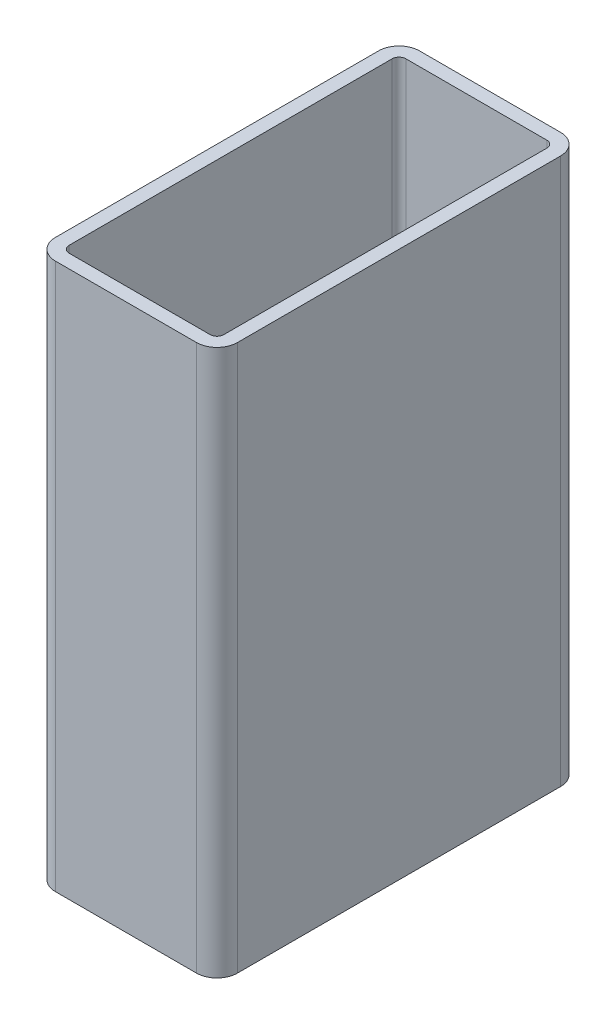
ISO-10303-21;
HEADER;
FILE_DESCRIPTION(('STEP AP214'),'2;1');
FILE_NAME('part.step','',(''),(''),'','','');
FILE_SCHEMA(('AUTOMOTIVE_DESIGN { 1 0 10303 214 1 1 1 1 }'));
ENDSEC;
DATA;
#1=APPLICATION_CONTEXT('core data for automotive mechanical design processes');
#2=APPLICATION_PROTOCOL_DEFINITION('international standard','automotive_design',2000,#1);
#3=PRODUCT_CONTEXT('',#1,'mechanical');
#4=PRODUCT('Part','Part','',(#3));
#5=PRODUCT_RELATED_PRODUCT_CATEGORY('part','',(#4));
#6=PRODUCT_DEFINITION_FORMATION('','',#4);
#7=PRODUCT_DEFINITION_CONTEXT('part definition',#1,'design');
#8=PRODUCT_DEFINITION('design','',#6,#7);
#9=PRODUCT_DEFINITION_SHAPE('','',#8);
#10=(LENGTH_UNIT() NAMED_UNIT(*) SI_UNIT(.MILLI.,.METRE.));
#11=(NAMED_UNIT(*) PLANE_ANGLE_UNIT() SI_UNIT($,.RADIAN.));
#12=(NAMED_UNIT(*) SI_UNIT($,.STERADIAN.) SOLID_ANGLE_UNIT());
#13=UNCERTAINTY_MEASURE_WITH_UNIT(LENGTH_MEASURE(1.E-05),#10,'distance_accuracy_value','');
#14=(GEOMETRIC_REPRESENTATION_CONTEXT(3) GLOBAL_UNCERTAINTY_ASSIGNED_CONTEXT((#13)) GLOBAL_UNIT_ASSIGNED_CONTEXT((#10,
#11,#12)) REPRESENTATION_CONTEXT('',''));
#15=CARTESIAN_POINT('',(0.,0.,0.));
#16=DIRECTION('',(0.,0.,1.));
#17=DIRECTION('',(1.,0.,0.));
#18=AXIS2_PLACEMENT_3D('',#15,#16,#17);
#19=CARTESIAN_POINT('',(-7.75,30.,-17.75));
#20=DIRECTION('',(0.,-1.,0.));
#21=DIRECTION('',(0.,0.,-1.));
#22=AXIS2_PLACEMENT_3D('',#19,#20,#21);
#23=CYLINDRICAL_SURFACE('',#22,2.25);
#24=CARTESIAN_POINT('',(-7.75,-30.,-17.75));
#25=DIRECTION('',(0.,-1.,0.));
#26=DIRECTION('',(0.,0.,-1.));
#27=AXIS2_PLACEMENT_3D('',#24,#25,#26);
#28=CIRCLE('',#27,2.25);
#29=CARTESIAN_POINT('',(-10.,-30.,-17.75));
#30=VERTEX_POINT('',#29);
#31=CARTESIAN_POINT('',(-7.74999999999999,-30.,-20.));
#32=VERTEX_POINT('',#31);
#33=EDGE_CURVE('E257',#30,#32,#28,.T.);
#34=ORIENTED_EDGE('',*,*,#33,.F.);
#35=DIRECTION('',(0.,-1.,0.));
#36=VECTOR('',#35,1.);
#37=CARTESIAN_POINT('',(-10.,30.,-17.75));
#38=LINE('',#37,#36);
#39=CARTESIAN_POINT('',(-10.,30.,-17.75));
#40=VERTEX_POINT('',#39);
#41=EDGE_CURVE('E12',#40,#30,#38,.T.);
#42=ORIENTED_EDGE('',*,*,#41,.F.);
#43=CARTESIAN_POINT('',(-7.75,30.,-17.75));
#44=DIRECTION('',(0.,-1.,0.));
#45=DIRECTION('',(0.,0.,-1.));
#46=AXIS2_PLACEMENT_3D('',#43,#44,#45);
#47=CIRCLE('',#46,2.25);
#48=CARTESIAN_POINT('',(-7.74999999999999,30.,-20.));
#49=VERTEX_POINT('',#48);
#50=EDGE_CURVE('E269',#40,#49,#47,.T.);
#51=ORIENTED_EDGE('',*,*,#50,.T.);
#52=DIRECTION('',(0.,-1.,0.));
#53=VECTOR('',#52,1.);
#54=CARTESIAN_POINT('',(-7.74999999999999,30.,-20.));
#55=LINE('',#54,#53);
#56=EDGE_CURVE('E92',#49,#32,#55,.T.);
#57=ORIENTED_EDGE('',*,*,#56,.T.);
#58=EDGE_LOOP('',(#34,#42,#51,#57));
#59=FACE_BOUND('',#58,.T.);
#60=ADVANCED_FACE('F89',(#59),#23,.T.);
#61=CARTESIAN_POINT('',(-10.,30.,17.75));
#62=DIRECTION('',(-1.,0.,0.));
#63=DIRECTION('',(0.,0.,1.));
#64=AXIS2_PLACEMENT_3D('',#61,#62,#63);
#65=PLANE('',#64);
#66=DIRECTION('',(0.,0.,-1.));
#67=VECTOR('',#66,1.);
#68=CARTESIAN_POINT('',(-10.,-30.,17.75));
#69=LINE('',#68,#67);
#70=CARTESIAN_POINT('',(-10.,-30.,17.75));
#71=VERTEX_POINT('',#70);
#72=EDGE_CURVE('E273',#71,#30,#69,.T.);
#73=ORIENTED_EDGE('',*,*,#72,.F.);
#74=DIRECTION('',(0.,-1.,0.));
#75=VECTOR('',#74,1.);
#76=CARTESIAN_POINT('',(-10.,30.,17.75));
#77=LINE('',#76,#75);
#78=CARTESIAN_POINT('',(-10.,30.,17.75));
#79=VERTEX_POINT('',#78);
#80=EDGE_CURVE('E97',#79,#71,#77,.T.);
#81=ORIENTED_EDGE('',*,*,#80,.F.);
#82=DIRECTION('',(0.,0.,-1.));
#83=VECTOR('',#82,1.);
#84=CARTESIAN_POINT('',(-10.,30.,17.75));
#85=LINE('',#84,#83);
#86=EDGE_CURVE('E288',#79,#40,#85,.T.);
#87=ORIENTED_EDGE('',*,*,#86,.T.);
#88=ORIENTED_EDGE('',*,*,#41,.T.);
#89=EDGE_LOOP('',(#73,#81,#87,#88));
#90=FACE_BOUND('',#89,.T.);
#91=ADVANCED_FACE('F336',(#90),#65,.T.);
#92=CARTESIAN_POINT('',(-7.75,30.,17.75));
#93=DIRECTION('',(0.,-1.,0.));
#94=DIRECTION('',(0.,0.,-1.));
#95=AXIS2_PLACEMENT_3D('',#92,#93,#94);
#96=CYLINDRICAL_SURFACE('',#95,2.25);
#97=CARTESIAN_POINT('',(-7.75,-30.,17.75));
#98=DIRECTION('',(0.,-1.,0.));
#99=DIRECTION('',(0.,0.,-1.));
#100=AXIS2_PLACEMENT_3D('',#97,#98,#99);
#101=CIRCLE('',#100,2.25);
#102=CARTESIAN_POINT('',(-7.74999999999999,-30.,20.));
#103=VERTEX_POINT('',#102);
#104=EDGE_CURVE('E306',#103,#71,#101,.T.);
#105=ORIENTED_EDGE('',*,*,#104,.F.);
#106=DIRECTION('',(0.,-1.,0.));
#107=VECTOR('',#106,1.);
#108=CARTESIAN_POINT('',(-7.74999999999999,30.,20.));
#109=LINE('',#108,#107);
#110=CARTESIAN_POINT('',(-7.74999999999999,30.,20.));
#111=VERTEX_POINT('',#110);
#112=EDGE_CURVE('E312',#111,#103,#109,.T.);
#113=ORIENTED_EDGE('',*,*,#112,.F.);
#114=CARTESIAN_POINT('',(-7.75,30.,17.75));
#115=DIRECTION('',(0.,-1.,0.));
#116=DIRECTION('',(0.,0.,-1.));
#117=AXIS2_PLACEMENT_3D('',#114,#115,#116);
#118=CIRCLE('',#117,2.25);
#119=EDGE_CURVE('E285',#111,#79,#118,.T.);
#120=ORIENTED_EDGE('',*,*,#119,.T.);
#121=ORIENTED_EDGE('',*,*,#80,.T.);
#122=EDGE_LOOP('',(#105,#113,#120,#121));
#123=FACE_BOUND('',#122,.T.);
#124=ADVANCED_FACE('F357',(#123),#96,.T.);
#125=CARTESIAN_POINT('',(-7.74999999999999,30.,20.));
#126=DIRECTION('',(0.,0.,-1.));
#127=DIRECTION('',(-1.,0.,0.));
#128=AXIS2_PLACEMENT_3D('',#125,#126,#127);
#129=PLANE('',#128);
#130=DIRECTION('',(1.,0.,0.));
#131=VECTOR('',#130,1.);
#132=CARTESIAN_POINT('',(-7.74999999999999,-30.,20.));
#133=LINE('',#132,#131);
#134=CARTESIAN_POINT('',(7.74999999999999,-30.,20.));
#135=VERTEX_POINT('',#134);
#136=EDGE_CURVE('E304',#103,#135,#133,.T.);
#137=ORIENTED_EDGE('',*,*,#136,.T.);
#138=DIRECTION('',(0.,-1.,0.));
#139=VECTOR('',#138,1.);
#140=CARTESIAN_POINT('',(7.74999999999999,30.,20.));
#141=LINE('',#140,#139);
#142=CARTESIAN_POINT('',(7.74999999999999,30.,20.));
#143=VERTEX_POINT('',#142);
#144=EDGE_CURVE('E314',#143,#135,#141,.T.);
#145=ORIENTED_EDGE('',*,*,#144,.F.);
#146=DIRECTION('',(1.,0.,0.));
#147=VECTOR('',#146,1.);
#148=CARTESIAN_POINT('',(-7.74999999999999,30.,20.));
#149=LINE('',#148,#147);
#150=EDGE_CURVE('E283',#111,#143,#149,.T.);
#151=ORIENTED_EDGE('',*,*,#150,.F.);
#152=ORIENTED_EDGE('',*,*,#112,.T.);
#153=EDGE_LOOP('',(#137,#145,#151,#152));
#154=FACE_BOUND('',#153,.T.);
#155=ADVANCED_FACE('F355',(#154),#129,.F.);
#156=CARTESIAN_POINT('',(7.75,30.,17.75));
#157=DIRECTION('',(0.,-1.,0.));
#158=DIRECTION('',(0.,0.,-1.));
#159=AXIS2_PLACEMENT_3D('',#156,#157,#158);
#160=CYLINDRICAL_SURFACE('',#159,2.25);
#161=CARTESIAN_POINT('',(7.75,-30.,17.75));
#162=DIRECTION('',(0.,1.,0.));
#163=DIRECTION('',(0.,0.,1.));
#164=AXIS2_PLACEMENT_3D('',#161,#162,#163);
#165=CIRCLE('',#164,2.25);
#166=CARTESIAN_POINT('',(10.,-30.,17.75));
#167=VERTEX_POINT('',#166);
#168=EDGE_CURVE('E302',#135,#167,#165,.T.);
#169=ORIENTED_EDGE('',*,*,#168,.T.);
#170=DIRECTION('',(0.,-1.,0.));
#171=VECTOR('',#170,1.);
#172=CARTESIAN_POINT('',(10.,30.,17.75));
#173=LINE('',#172,#171);
#174=CARTESIAN_POINT('',(10.,30.,17.75));
#175=VERTEX_POINT('',#174);
#176=EDGE_CURVE('E317',#175,#167,#173,.T.);
#177=ORIENTED_EDGE('',*,*,#176,.F.);
#178=CARTESIAN_POINT('',(7.75,30.,17.75));
#179=DIRECTION('',(0.,1.,0.));
#180=DIRECTION('',(0.,0.,1.));
#181=AXIS2_PLACEMENT_3D('',#178,#179,#180);
#182=CIRCLE('',#181,2.25);
#183=EDGE_CURVE('E281',#143,#175,#182,.T.);
#184=ORIENTED_EDGE('',*,*,#183,.F.);
#185=ORIENTED_EDGE('',*,*,#144,.T.);
#186=EDGE_LOOP('',(#169,#177,#184,#185));
#187=FACE_BOUND('',#186,.T.);
#188=ADVANCED_FACE('F351',(#187),#160,.T.);
#189=CARTESIAN_POINT('',(10.,30.,17.75));
#190=DIRECTION('',(-1.,0.,0.));
#191=DIRECTION('',(0.,0.,1.));
#192=AXIS2_PLACEMENT_3D('',#189,#190,#191);
#193=PLANE('',#192);
#194=DIRECTION('',(0.,0.,-1.));
#195=VECTOR('',#194,1.);
#196=CARTESIAN_POINT('',(10.,-30.,17.75));
#197=LINE('',#196,#195);
#198=CARTESIAN_POINT('',(10.,-30.,-17.75));
#199=VERTEX_POINT('',#198);
#200=EDGE_CURVE('E299',#167,#199,#197,.T.);
#201=ORIENTED_EDGE('',*,*,#200,.T.);
#202=DIRECTION('',(0.,-1.,0.));
#203=VECTOR('',#202,1.);
#204=CARTESIAN_POINT('',(10.,30.,-17.75));
#205=LINE('',#204,#203);
#206=CARTESIAN_POINT('',(10.,30.,-17.75));
#207=VERTEX_POINT('',#206);
#208=EDGE_CURVE('E320',#207,#199,#205,.T.);
#209=ORIENTED_EDGE('',*,*,#208,.F.);
#210=DIRECTION('',(0.,0.,-1.));
#211=VECTOR('',#210,1.);
#212=CARTESIAN_POINT('',(10.,30.,17.75));
#213=LINE('',#212,#211);
#214=EDGE_CURVE('E279',#175,#207,#213,.T.);
#215=ORIENTED_EDGE('',*,*,#214,.F.);
#216=ORIENTED_EDGE('',*,*,#176,.T.);
#217=EDGE_LOOP('',(#201,#209,#215,#216));
#218=FACE_BOUND('',#217,.T.);
#219=ADVANCED_FACE('F347',(#218),#193,.F.);
#220=CARTESIAN_POINT('',(7.75,30.,-17.75));
#221=DIRECTION('',(0.,-1.,0.));
#222=DIRECTION('',(0.,0.,-1.));
#223=AXIS2_PLACEMENT_3D('',#220,#221,#222);
#224=CYLINDRICAL_SURFACE('',#223,2.25);
#225=CARTESIAN_POINT('',(7.75,-30.,-17.75));
#226=DIRECTION('',(0.,-1.,0.));
#227=DIRECTION('',(0.,0.,-1.));
#228=AXIS2_PLACEMENT_3D('',#225,#226,#227);
#229=CIRCLE('',#228,2.25);
#230=CARTESIAN_POINT('',(7.74999999999999,-30.,-20.));
#231=VERTEX_POINT('',#230);
#232=EDGE_CURVE('E296',#231,#199,#229,.T.);
#233=ORIENTED_EDGE('',*,*,#232,.F.);
#234=DIRECTION('',(0.,-1.,0.));
#235=VECTOR('',#234,1.);
#236=CARTESIAN_POINT('',(7.74999999999999,30.,-20.));
#237=LINE('',#236,#235);
#238=CARTESIAN_POINT('',(7.74999999999999,30.,-20.));
#239=VERTEX_POINT('',#238);
#240=EDGE_CURVE('E321',#239,#231,#237,.T.);
#241=ORIENTED_EDGE('',*,*,#240,.F.);
#242=CARTESIAN_POINT('',(7.75,30.,-17.75));
#243=DIRECTION('',(0.,-1.,0.));
#244=DIRECTION('',(0.,0.,-1.));
#245=AXIS2_PLACEMENT_3D('',#242,#243,#244);
#246=CIRCLE('',#245,2.25);
#247=EDGE_CURVE('E276',#239,#207,#246,.T.);
#248=ORIENTED_EDGE('',*,*,#247,.T.);
#249=ORIENTED_EDGE('',*,*,#208,.T.);
#250=EDGE_LOOP('',(#233,#241,#248,#249));
#251=FACE_BOUND('',#250,.T.);
#252=ADVANCED_FACE('F343',(#251),#224,.T.);
#253=CARTESIAN_POINT('',(-7.74999999999999,30.,-20.));
#254=DIRECTION('',(0.,0.,-1.));
#255=DIRECTION('',(-1.,0.,0.));
#256=AXIS2_PLACEMENT_3D('',#253,#254,#255);
#257=PLANE('',#256);
#258=DIRECTION('',(1.,0.,0.));
#259=VECTOR('',#258,1.);
#260=CARTESIAN_POINT('',(-7.74999999999999,-30.,-20.));
#261=LINE('',#260,#259);
#262=EDGE_CURVE('E293',#32,#231,#261,.T.);
#263=ORIENTED_EDGE('',*,*,#262,.F.);
#264=ORIENTED_EDGE('',*,*,#56,.F.);
#265=DIRECTION('',(1.,0.,0.));
#266=VECTOR('',#265,1.);
#267=CARTESIAN_POINT('',(-7.74999999999999,30.,-20.));
#268=LINE('',#267,#266);
#269=EDGE_CURVE('E272',#49,#239,#268,.T.);
#270=ORIENTED_EDGE('',*,*,#269,.T.);
#271=ORIENTED_EDGE('',*,*,#240,.T.);
#272=EDGE_LOOP('',(#263,#264,#270,#271));
#273=FACE_BOUND('',#272,.T.);
#274=ADVANCED_FACE('F329',(#273),#257,.T.);
#275=CARTESIAN_POINT('',(-7.75,30.,-17.75));
#276=DIRECTION('',(0.,-1.,0.));
#277=DIRECTION('',(0.,0.,-1.));
#278=AXIS2_PLACEMENT_3D('',#275,#276,#277);
#279=PLANE('',#278);
#280=DIRECTION('',(0.,0.,-1.));
#281=VECTOR('',#280,1.);
#282=CARTESIAN_POINT('',(-8.5,30.,17.75));
#283=LINE('',#282,#281);
#284=CARTESIAN_POINT('',(-8.5,30.,17.75));
#285=VERTEX_POINT('',#284);
#286=CARTESIAN_POINT('',(-8.5,30.,-17.75));
#287=VERTEX_POINT('',#286);
#288=EDGE_CURVE('E211',#285,#287,#283,.T.);
#289=ORIENTED_EDGE('',*,*,#288,.T.);
#290=CARTESIAN_POINT('',(-7.75,30.,-17.75));
#291=DIRECTION('',(0.,-1.,0.));
#292=DIRECTION('',(0.,0.,-1.));
#293=AXIS2_PLACEMENT_3D('',#290,#291,#292);
#294=CIRCLE('',#293,0.749999999999998);
#295=CARTESIAN_POINT('',(-7.74999999999999,30.,-18.5));
#296=VERTEX_POINT('',#295);
#297=EDGE_CURVE('E205',#287,#296,#294,.T.);
#298=ORIENTED_EDGE('',*,*,#297,.T.);
#299=DIRECTION('',(1.,0.,0.));
#300=VECTOR('',#299,1.);
#301=CARTESIAN_POINT('',(-7.74999999999999,30.,-18.5));
#302=LINE('',#301,#300);
#303=CARTESIAN_POINT('',(7.74999999999999,30.,-18.5));
#304=VERTEX_POINT('',#303);
#305=EDGE_CURVE('E214',#296,#304,#302,.T.);
#306=ORIENTED_EDGE('',*,*,#305,.T.);
#307=CARTESIAN_POINT('',(7.75,30.,-17.75));
#308=DIRECTION('',(0.,-1.,0.));
#309=DIRECTION('',(0.,0.,-1.));
#310=AXIS2_PLACEMENT_3D('',#307,#308,#309);
#311=CIRCLE('',#310,0.749999999999998);
#312=CARTESIAN_POINT('',(8.5,30.,-17.75));
#313=VERTEX_POINT('',#312);
#314=EDGE_CURVE('E105',#304,#313,#311,.T.);
#315=ORIENTED_EDGE('',*,*,#314,.T.);
#316=DIRECTION('',(0.,0.,-1.));
#317=VECTOR('',#316,1.);
#318=CARTESIAN_POINT('',(8.5,30.,17.75));
#319=LINE('',#318,#317);
#320=CARTESIAN_POINT('',(8.5,30.,17.75));
#321=VERTEX_POINT('',#320);
#322=EDGE_CURVE('E229',#321,#313,#319,.T.);
#323=ORIENTED_EDGE('',*,*,#322,.F.);
#324=CARTESIAN_POINT('',(7.75,30.,17.75));
#325=DIRECTION('',(0.,1.,0.));
#326=DIRECTION('',(0.,0.,1.));
#327=AXIS2_PLACEMENT_3D('',#324,#325,#326);
#328=CIRCLE('',#327,0.75);
#329=CARTESIAN_POINT('',(7.75,30.,18.5));
#330=VERTEX_POINT('',#329);
#331=EDGE_CURVE('E231',#330,#321,#328,.T.);
#332=ORIENTED_EDGE('',*,*,#331,.F.);
#333=DIRECTION('',(1.,0.,0.));
#334=VECTOR('',#333,1.);
#335=CARTESIAN_POINT('',(-7.74999999999999,30.,18.5));
#336=LINE('',#335,#334);
#337=CARTESIAN_POINT('',(-7.74999999999999,30.,18.5));
#338=VERTEX_POINT('',#337);
#339=EDGE_CURVE('E233',#338,#330,#336,.T.);
#340=ORIENTED_EDGE('',*,*,#339,.F.);
#341=CARTESIAN_POINT('',(-7.75,30.,17.75));
#342=DIRECTION('',(0.,-1.,0.));
#343=DIRECTION('',(0.,0.,-1.));
#344=AXIS2_PLACEMENT_3D('',#341,#342,#343);
#345=CIRCLE('',#344,0.749999999999998);
#346=EDGE_CURVE('E235',#338,#285,#345,.T.);
#347=ORIENTED_EDGE('',*,*,#346,.T.);
#348=EDGE_LOOP('',(#289,#298,#306,#315,#323,#332,#340,#347));
#349=FACE_BOUND('',#348,.T.);
#350=ORIENTED_EDGE('',*,*,#50,.F.);
#351=ORIENTED_EDGE('',*,*,#86,.F.);
#352=ORIENTED_EDGE('',*,*,#119,.F.);
#353=ORIENTED_EDGE('',*,*,#150,.T.);
#354=ORIENTED_EDGE('',*,*,#183,.T.);
#355=ORIENTED_EDGE('',*,*,#214,.T.);
#356=ORIENTED_EDGE('',*,*,#247,.F.);
#357=ORIENTED_EDGE('',*,*,#269,.F.);
#358=EDGE_LOOP('',(#350,#351,#352,#353,#354,#355,#356,#357));
#359=FACE_BOUND('',#358,.T.);
#360=ADVANCED_FACE('F218',(#349,#359),#279,.F.);
#361=CARTESIAN_POINT('',(-7.75,-30.,-17.75));
#362=DIRECTION('',(0.,-1.,0.));
#363=DIRECTION('',(0.,0.,-1.));
#364=AXIS2_PLACEMENT_3D('',#361,#362,#363);
#365=PLANE('',#364);
#366=CARTESIAN_POINT('',(-7.75,-30.,-17.75));
#367=DIRECTION('',(0.,-1.,0.));
#368=DIRECTION('',(0.,0.,-1.));
#369=AXIS2_PLACEMENT_3D('',#366,#367,#368);
#370=CIRCLE('',#369,0.749999999999998);
#371=CARTESIAN_POINT('',(-8.5,-30.,-17.75));
#372=VERTEX_POINT('',#371);
#373=CARTESIAN_POINT('',(-7.74999999999999,-30.,-18.5));
#374=VERTEX_POINT('',#373);
#375=EDGE_CURVE('E113',#372,#374,#370,.T.);
#376=ORIENTED_EDGE('',*,*,#375,.F.);
#377=DIRECTION('',(0.,0.,-1.));
#378=VECTOR('',#377,1.);
#379=CARTESIAN_POINT('',(-8.5,-30.,17.75));
#380=LINE('',#379,#378);
#381=CARTESIAN_POINT('',(-8.5,-30.,17.75));
#382=VERTEX_POINT('',#381);
#383=EDGE_CURVE('E222',#382,#372,#380,.T.);
#384=ORIENTED_EDGE('',*,*,#383,.F.);
#385=CARTESIAN_POINT('',(-7.75,-30.,17.75));
#386=DIRECTION('',(0.,-1.,0.));
#387=DIRECTION('',(0.,0.,-1.));
#388=AXIS2_PLACEMENT_3D('',#385,#386,#387);
#389=CIRCLE('',#388,0.749999999999998);
#390=CARTESIAN_POINT('',(-7.74999999999999,-30.,18.5));
#391=VERTEX_POINT('',#390);
#392=EDGE_CURVE('E225',#391,#382,#389,.T.);
#393=ORIENTED_EDGE('',*,*,#392,.F.);
#394=DIRECTION('',(1.,0.,0.));
#395=VECTOR('',#394,1.);
#396=CARTESIAN_POINT('',(-7.74999999999999,-30.,18.5));
#397=LINE('',#396,#395);
#398=CARTESIAN_POINT('',(7.75,-30.,18.5));
#399=VERTEX_POINT('',#398);
#400=EDGE_CURVE('E250',#391,#399,#397,.T.);
#401=ORIENTED_EDGE('',*,*,#400,.T.);
#402=CARTESIAN_POINT('',(7.75,-30.,17.75));
#403=DIRECTION('',(0.,1.,0.));
#404=DIRECTION('',(0.,0.,1.));
#405=AXIS2_PLACEMENT_3D('',#402,#403,#404);
#406=CIRCLE('',#405,0.75);
#407=CARTESIAN_POINT('',(8.5,-30.,17.75));
#408=VERTEX_POINT('',#407);
#409=EDGE_CURVE('E247',#399,#408,#406,.T.);
#410=ORIENTED_EDGE('',*,*,#409,.T.);
#411=DIRECTION('',(0.,0.,-1.));
#412=VECTOR('',#411,1.);
#413=CARTESIAN_POINT('',(8.5,-30.,17.75));
#414=LINE('',#413,#412);
#415=CARTESIAN_POINT('',(8.5,-30.,-17.75));
#416=VERTEX_POINT('',#415);
#417=EDGE_CURVE('E244',#408,#416,#414,.T.);
#418=ORIENTED_EDGE('',*,*,#417,.T.);
#419=CARTESIAN_POINT('',(7.75,-30.,-17.75));
#420=DIRECTION('',(0.,-1.,0.));
#421=DIRECTION('',(0.,0.,-1.));
#422=AXIS2_PLACEMENT_3D('',#419,#420,#421);
#423=CIRCLE('',#422,0.749999999999998);
#424=CARTESIAN_POINT('',(7.74999999999999,-30.,-18.5));
#425=VERTEX_POINT('',#424);
#426=EDGE_CURVE('E241',#425,#416,#423,.T.);
#427=ORIENTED_EDGE('',*,*,#426,.F.);
#428=DIRECTION('',(1.,0.,0.));
#429=VECTOR('',#428,1.);
#430=CARTESIAN_POINT('',(-7.74999999999999,-30.,-18.5));
#431=LINE('',#430,#429);
#432=EDGE_CURVE('E239',#374,#425,#431,.T.);
#433=ORIENTED_EDGE('',*,*,#432,.F.);
#434=EDGE_LOOP('',(#376,#384,#393,#401,#410,#418,#427,#433));
#435=FACE_BOUND('',#434,.T.);
#436=ORIENTED_EDGE('',*,*,#33,.T.);
#437=ORIENTED_EDGE('',*,*,#262,.T.);
#438=ORIENTED_EDGE('',*,*,#232,.T.);
#439=ORIENTED_EDGE('',*,*,#200,.F.);
#440=ORIENTED_EDGE('',*,*,#168,.F.);
#441=ORIENTED_EDGE('',*,*,#136,.F.);
#442=ORIENTED_EDGE('',*,*,#104,.T.);
#443=ORIENTED_EDGE('',*,*,#72,.T.);
#444=EDGE_LOOP('',(#436,#437,#438,#439,#440,#441,#442,#443));
#445=FACE_BOUND('',#444,.T.);
#446=ADVANCED_FACE('F331',(#435,#445),#365,.T.);
#447=CARTESIAN_POINT('',(-7.75,30.,-17.75));
#448=DIRECTION('',(0.,-1.,0.));
#449=DIRECTION('',(0.,0.,-1.));
#450=AXIS2_PLACEMENT_3D('',#447,#448,#449);
#451=CYLINDRICAL_SURFACE('',#450,0.749999999999998);
#452=ORIENTED_EDGE('',*,*,#375,.T.);
#453=DIRECTION('',(0.,-1.,0.));
#454=VECTOR('',#453,1.);
#455=CARTESIAN_POINT('',(-7.74999999999999,30.,-18.5));
#456=LINE('',#455,#454);
#457=EDGE_CURVE('E201',#296,#374,#456,.T.);
#458=ORIENTED_EDGE('',*,*,#457,.F.);
#459=ORIENTED_EDGE('',*,*,#297,.F.);
#460=DIRECTION('',(0.,-1.,0.));
#461=VECTOR('',#460,1.);
#462=CARTESIAN_POINT('',(-8.5,30.,-17.75));
#463=LINE('',#462,#461);
#464=EDGE_CURVE('E255',#287,#372,#463,.T.);
#465=ORIENTED_EDGE('',*,*,#464,.T.);
#466=EDGE_LOOP('',(#452,#458,#459,#465));
#467=FACE_BOUND('',#466,.T.);
#468=ADVANCED_FACE('F203',(#467),#451,.F.);
#469=CARTESIAN_POINT('',(-8.5,30.,17.75));
#470=DIRECTION('',(-1.,0.,0.));
#471=DIRECTION('',(0.,0.,1.));
#472=AXIS2_PLACEMENT_3D('',#469,#470,#471);
#473=PLANE('',#472);
#474=ORIENTED_EDGE('',*,*,#383,.T.);
#475=ORIENTED_EDGE('',*,*,#464,.F.);
#476=ORIENTED_EDGE('',*,*,#288,.F.);
#477=DIRECTION('',(0.,-1.,0.));
#478=VECTOR('',#477,1.);
#479=CARTESIAN_POINT('',(-8.5,30.,17.75));
#480=LINE('',#479,#478);
#481=EDGE_CURVE('E258',#285,#382,#480,.T.);
#482=ORIENTED_EDGE('',*,*,#481,.T.);
#483=EDGE_LOOP('',(#474,#475,#476,#482));
#484=FACE_BOUND('',#483,.T.);
#485=ADVANCED_FACE('F442',(#484),#473,.F.);
#486=CARTESIAN_POINT('',(-7.75,30.,17.75));
#487=DIRECTION('',(0.,-1.,0.));
#488=DIRECTION('',(0.,0.,-1.));
#489=AXIS2_PLACEMENT_3D('',#486,#487,#488);
#490=CYLINDRICAL_SURFACE('',#489,0.749999999999998);
#491=ORIENTED_EDGE('',*,*,#392,.T.);
#492=ORIENTED_EDGE('',*,*,#481,.F.);
#493=ORIENTED_EDGE('',*,*,#346,.F.);
#494=DIRECTION('',(0.,-1.,0.));
#495=VECTOR('',#494,1.);
#496=CARTESIAN_POINT('',(-7.74999999999999,30.,18.5));
#497=LINE('',#496,#495);
#498=EDGE_CURVE('E260',#338,#391,#497,.T.);
#499=ORIENTED_EDGE('',*,*,#498,.T.);
#500=EDGE_LOOP('',(#491,#492,#493,#499));
#501=FACE_BOUND('',#500,.T.);
#502=ADVANCED_FACE('F451',(#501),#490,.F.);
#503=CARTESIAN_POINT('',(-7.74999999999999,30.,18.5));
#504=DIRECTION('',(0.,0.,-1.));
#505=DIRECTION('',(-1.,0.,0.));
#506=AXIS2_PLACEMENT_3D('',#503,#504,#505);
#507=PLANE('',#506);
#508=ORIENTED_EDGE('',*,*,#400,.F.);
#509=ORIENTED_EDGE('',*,*,#498,.F.);
#510=ORIENTED_EDGE('',*,*,#339,.T.);
#511=DIRECTION('',(0.,-1.,0.));
#512=VECTOR('',#511,1.);
#513=CARTESIAN_POINT('',(7.75,30.,18.5));
#514=LINE('',#513,#512);
#515=EDGE_CURVE('E262',#330,#399,#514,.T.);
#516=ORIENTED_EDGE('',*,*,#515,.T.);
#517=EDGE_LOOP('',(#508,#509,#510,#516));
#518=FACE_BOUND('',#517,.T.);
#519=ADVANCED_FACE('F461',(#518),#507,.T.);
#520=CARTESIAN_POINT('',(7.75,30.,17.75));
#521=DIRECTION('',(0.,-1.,0.));
#522=DIRECTION('',(0.,0.,-1.));
#523=AXIS2_PLACEMENT_3D('',#520,#521,#522);
#524=CYLINDRICAL_SURFACE('',#523,0.75);
#525=ORIENTED_EDGE('',*,*,#409,.F.);
#526=ORIENTED_EDGE('',*,*,#515,.F.);
#527=ORIENTED_EDGE('',*,*,#331,.T.);
#528=DIRECTION('',(0.,-1.,0.));
#529=VECTOR('',#528,1.);
#530=CARTESIAN_POINT('',(8.5,30.,17.75));
#531=LINE('',#530,#529);
#532=EDGE_CURVE('E264',#321,#408,#531,.T.);
#533=ORIENTED_EDGE('',*,*,#532,.T.);
#534=EDGE_LOOP('',(#525,#526,#527,#533));
#535=FACE_BOUND('',#534,.T.);
#536=ADVANCED_FACE('F471',(#535),#524,.F.);
#537=CARTESIAN_POINT('',(8.5,30.,17.75));
#538=DIRECTION('',(-1.,0.,0.));
#539=DIRECTION('',(0.,0.,1.));
#540=AXIS2_PLACEMENT_3D('',#537,#538,#539);
#541=PLANE('',#540);
#542=ORIENTED_EDGE('',*,*,#417,.F.);
#543=ORIENTED_EDGE('',*,*,#532,.F.);
#544=ORIENTED_EDGE('',*,*,#322,.T.);
#545=DIRECTION('',(0.,-1.,0.));
#546=VECTOR('',#545,1.);
#547=CARTESIAN_POINT('',(8.5,30.,-17.75));
#548=LINE('',#547,#546);
#549=EDGE_CURVE('E266',#313,#416,#548,.T.);
#550=ORIENTED_EDGE('',*,*,#549,.T.);
#551=EDGE_LOOP('',(#542,#543,#544,#550));
#552=FACE_BOUND('',#551,.T.);
#553=ADVANCED_FACE('F481',(#552),#541,.T.);
#554=CARTESIAN_POINT('',(7.75,30.,-17.75));
#555=DIRECTION('',(0.,-1.,0.));
#556=DIRECTION('',(0.,0.,-1.));
#557=AXIS2_PLACEMENT_3D('',#554,#555,#556);
#558=CYLINDRICAL_SURFACE('',#557,0.749999999999998);
#559=ORIENTED_EDGE('',*,*,#426,.T.);
#560=ORIENTED_EDGE('',*,*,#549,.F.);
#561=ORIENTED_EDGE('',*,*,#314,.F.);
#562=DIRECTION('',(0.,-1.,0.));
#563=VECTOR('',#562,1.);
#564=CARTESIAN_POINT('',(7.74999999999999,30.,-18.5));
#565=LINE('',#564,#563);
#566=EDGE_CURVE('E210',#304,#425,#565,.T.);
#567=ORIENTED_EDGE('',*,*,#566,.T.);
#568=EDGE_LOOP('',(#559,#560,#561,#567));
#569=FACE_BOUND('',#568,.T.);
#570=ADVANCED_FACE('F491',(#569),#558,.F.);
#571=CARTESIAN_POINT('',(-7.74999999999999,30.,-18.5));
#572=DIRECTION('',(0.,0.,-1.));
#573=DIRECTION('',(-1.,0.,0.));
#574=AXIS2_PLACEMENT_3D('',#571,#572,#573);
#575=PLANE('',#574);
#576=ORIENTED_EDGE('',*,*,#432,.T.);
#577=ORIENTED_EDGE('',*,*,#566,.F.);
#578=ORIENTED_EDGE('',*,*,#305,.F.);
#579=ORIENTED_EDGE('',*,*,#457,.T.);
#580=EDGE_LOOP('',(#576,#577,#578,#579));
#581=FACE_BOUND('',#580,.T.);
#582=ADVANCED_FACE('F215',(#581),#575,.F.);
#583=CLOSED_SHELL('',(#60,#91,#124,#155,#188,#219,#252,#274,#360,#446,#468,#485,#502,#519,#536,
#553,#570,#582));
#584=MANIFOLD_SOLID_BREP('B2',#583);
#585=ADVANCED_BREP_SHAPE_REPRESENTATION('',(#18,#584),#14);
#586=SHAPE_DEFINITION_REPRESENTATION(#9,#585);
ENDSEC;
END-ISO-10303-21;
